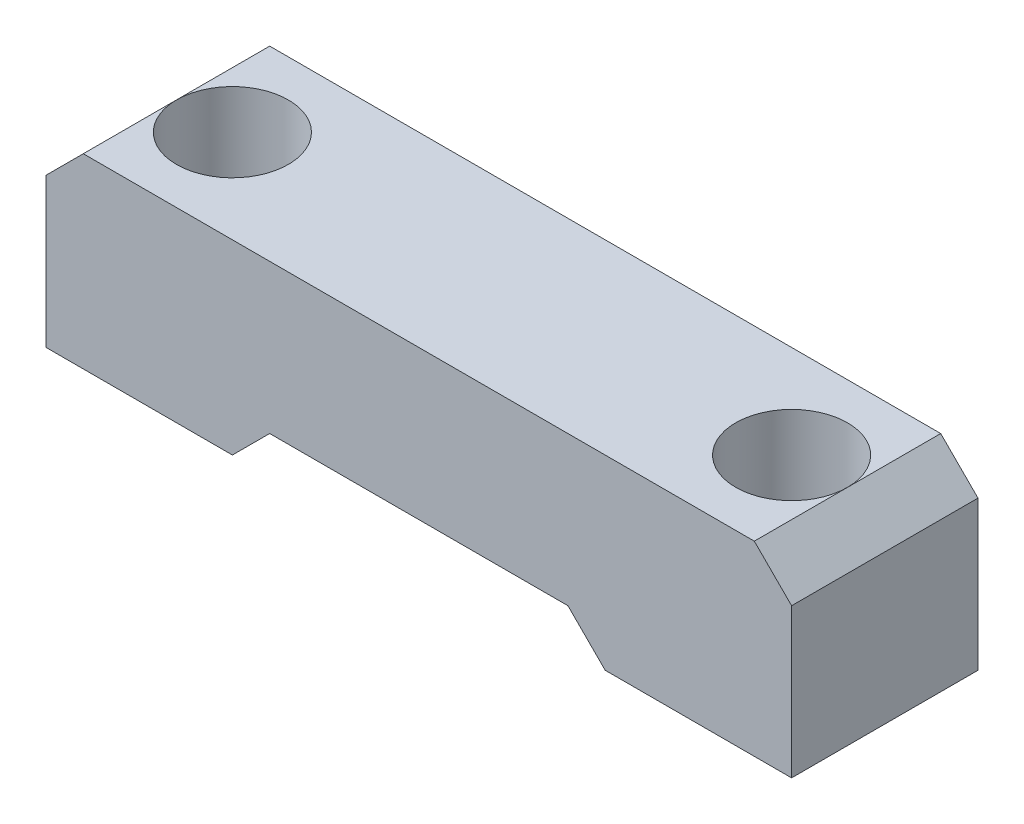
ISO-10303-21;
HEADER;
FILE_DESCRIPTION(('STEP AP214'),'2;1');
FILE_NAME('part.step','',(''),(''),'','','');
FILE_SCHEMA(('AUTOMOTIVE_DESIGN { 1 0 10303 214 1 1 1 1 }'));
ENDSEC;
DATA;
#1=APPLICATION_CONTEXT('core data for automotive mechanical design processes');
#2=APPLICATION_PROTOCOL_DEFINITION('international standard','automotive_design',2000,#1);
#3=PRODUCT_CONTEXT('',#1,'mechanical');
#4=PRODUCT('Part','Part','',(#3));
#5=PRODUCT_RELATED_PRODUCT_CATEGORY('part','',(#4));
#6=PRODUCT_DEFINITION_FORMATION('','',#4);
#7=PRODUCT_DEFINITION_CONTEXT('part definition',#1,'design');
#8=PRODUCT_DEFINITION('design','',#6,#7);
#9=PRODUCT_DEFINITION_SHAPE('','',#8);
#10=(LENGTH_UNIT() NAMED_UNIT(*) SI_UNIT(.MILLI.,.METRE.));
#11=(NAMED_UNIT(*) PLANE_ANGLE_UNIT() SI_UNIT($,.RADIAN.));
#12=(NAMED_UNIT(*) SI_UNIT($,.STERADIAN.) SOLID_ANGLE_UNIT());
#13=UNCERTAINTY_MEASURE_WITH_UNIT(LENGTH_MEASURE(1.E-05),#10,'distance_accuracy_value','');
#14=(GEOMETRIC_REPRESENTATION_CONTEXT(3) GLOBAL_UNCERTAINTY_ASSIGNED_CONTEXT((#13)) GLOBAL_UNIT_ASSIGNED_CONTEXT((#10,
#11,#12)) REPRESENTATION_CONTEXT('',''));
#15=CARTESIAN_POINT('',(0.,0.,0.));
#16=DIRECTION('',(0.,0.,1.));
#17=DIRECTION('',(1.,0.,0.));
#18=AXIS2_PLACEMENT_3D('',#15,#16,#17);
#19=CARTESIAN_POINT('',(5.,0.,2.5));
#20=DIRECTION('',(0.,1.,0.));
#21=DIRECTION('',(0.,0.,1.));
#22=AXIS2_PLACEMENT_3D('',#19,#20,#21);
#23=PLANE('',#22);
#24=CARTESIAN_POINT('',(7.5,0.,0.));
#25=DIRECTION('',(0.,1.,0.));
#26=DIRECTION('',(0.,0.,1.));
#27=AXIS2_PLACEMENT_3D('',#24,#25,#26);
#28=CIRCLE('',#27,1.5);
#29=CARTESIAN_POINT('',(7.5,0.,1.5));
#30=VERTEX_POINT('',#29);
#31=EDGE_CURVE('E207',#30,#30,#28,.T.);
#32=ORIENTED_EDGE('',*,*,#31,.T.);
#33=EDGE_LOOP('',(#32));
#34=FACE_BOUND('',#33,.T.);
#35=DIRECTION('',(1.,0.,0.));
#36=VECTOR('',#35,1.);
#37=CARTESIAN_POINT('',(5.,0.,-2.5));
#38=LINE('',#37,#36);
#39=CARTESIAN_POINT('',(5.,0.,-2.5));
#40=VERTEX_POINT('',#39);
#41=CARTESIAN_POINT('',(10.,0.,-2.5));
#42=VERTEX_POINT('',#41);
#43=EDGE_CURVE('E206',#40,#42,#38,.T.);
#44=ORIENTED_EDGE('',*,*,#43,.T.);
#45=DIRECTION('',(0.,0.,-1.));
#46=VECTOR('',#45,1.);
#47=CARTESIAN_POINT('',(10.,0.,2.5));
#48=LINE('',#47,#46);
#49=CARTESIAN_POINT('',(10.,0.,2.5));
#50=VERTEX_POINT('',#49);
#51=EDGE_CURVE('E136',#50,#42,#48,.T.);
#52=ORIENTED_EDGE('',*,*,#51,.F.);
#53=DIRECTION('',(1.,0.,0.));
#54=VECTOR('',#53,1.);
#55=CARTESIAN_POINT('',(5.,0.,2.5));
#56=LINE('',#55,#54);
#57=CARTESIAN_POINT('',(5.,0.,2.5));
#58=VERTEX_POINT('',#57);
#59=EDGE_CURVE('E123',#58,#50,#56,.T.);
#60=ORIENTED_EDGE('',*,*,#59,.F.);
#61=DIRECTION('',(0.,0.,-1.));
#62=VECTOR('',#61,1.);
#63=CARTESIAN_POINT('',(5.,0.,2.5));
#64=LINE('',#63,#62);
#65=EDGE_CURVE('E134',#58,#40,#64,.T.);
#66=ORIENTED_EDGE('',*,*,#65,.T.);
#67=EDGE_LOOP('',(#44,#52,#60,#66));
#68=FACE_BOUND('',#67,.T.);
#69=ADVANCED_FACE('F36',(#34,#68),#23,.F.);
#70=CARTESIAN_POINT('',(10.,0.,2.5));
#71=DIRECTION('',(-1.,0.,0.));
#72=DIRECTION('',(0.,-1.,0.));
#73=AXIS2_PLACEMENT_3D('',#70,#71,#72);
#74=PLANE('',#73);
#75=DIRECTION('',(0.,1.,0.));
#76=VECTOR('',#75,1.);
#77=CARTESIAN_POINT('',(10.,0.,-2.5));
#78=LINE('',#77,#76);
#79=CARTESIAN_POINT('',(10.,4.,-2.5));
#80=VERTEX_POINT('',#79);
#81=EDGE_CURVE('E204',#42,#80,#78,.T.);
#82=ORIENTED_EDGE('',*,*,#81,.T.);
#83=DIRECTION('',(0.,0.,1.));
#84=VECTOR('',#83,1.);
#85=CARTESIAN_POINT('',(10.,4.,2.5));
#86=LINE('',#85,#84);
#87=CARTESIAN_POINT('',(10.,4.,2.5));
#88=VERTEX_POINT('',#87);
#89=EDGE_CURVE('E59',#80,#88,#86,.T.);
#90=ORIENTED_EDGE('',*,*,#89,.T.);
#91=DIRECTION('',(0.,1.,0.));
#92=VECTOR('',#91,1.);
#93=CARTESIAN_POINT('',(10.,0.,2.5));
#94=LINE('',#93,#92);
#95=EDGE_CURVE('E137',#50,#88,#94,.T.);
#96=ORIENTED_EDGE('',*,*,#95,.F.);
#97=ORIENTED_EDGE('',*,*,#51,.T.);
#98=EDGE_LOOP('',(#82,#90,#96,#97));
#99=FACE_BOUND('',#98,.T.);
#100=ADVANCED_FACE('F258',(#99),#74,.F.);
#101=CARTESIAN_POINT('',(10.,5.,2.5));
#102=DIRECTION('',(0.,-1.,0.));
#103=DIRECTION('',(1.,0.,0.));
#104=AXIS2_PLACEMENT_3D('',#101,#102,#103);
#105=PLANE('',#104);
#106=DIRECTION('',(-1.,0.,0.));
#107=VECTOR('',#106,1.);
#108=CARTESIAN_POINT('',(10.,5.,2.5));
#109=LINE('',#108,#107);
#110=CARTESIAN_POINT('',(9.,5.,2.5));
#111=VERTEX_POINT('',#110);
#112=CARTESIAN_POINT('',(-9.,5.,2.5));
#113=VERTEX_POINT('',#112);
#114=EDGE_CURVE('E212',#111,#113,#109,.T.);
#115=ORIENTED_EDGE('',*,*,#114,.F.);
#116=DIRECTION('',(0.,0.,-1.));
#117=VECTOR('',#116,1.);
#118=CARTESIAN_POINT('',(9.,5.,2.5));
#119=LINE('',#118,#117);
#120=CARTESIAN_POINT('',(9.,5.,0.));
#121=VERTEX_POINT('',#120);
#122=EDGE_CURVE('E158',#111,#121,#119,.T.);
#123=ORIENTED_EDGE('',*,*,#122,.T.);
#124=CARTESIAN_POINT('',(7.5,5.,0.));
#125=DIRECTION('',(0.,1.,0.));
#126=DIRECTION('',(0.,0.,1.));
#127=AXIS2_PLACEMENT_3D('',#124,#125,#126);
#128=CIRCLE('',#127,1.5);
#129=EDGE_CURVE('E217',#121,#121,#128,.T.);
#130=ORIENTED_EDGE('',*,*,#129,.F.);
#131=DIRECTION('',(0.,0.,-1.));
#132=VECTOR('',#131,1.);
#133=CARTESIAN_POINT('',(9.,5.,2.5));
#134=LINE('',#133,#132);
#135=CARTESIAN_POINT('',(9.,5.,-2.5));
#136=VERTEX_POINT('',#135);
#137=EDGE_CURVE('E156',#121,#136,#134,.T.);
#138=ORIENTED_EDGE('',*,*,#137,.T.);
#139=DIRECTION('',(-1.,0.,0.));
#140=VECTOR('',#139,1.);
#141=CARTESIAN_POINT('',(10.,5.,-2.5));
#142=LINE('',#141,#140);
#143=CARTESIAN_POINT('',(-9.,5.,-2.5));
#144=VERTEX_POINT('',#143);
#145=EDGE_CURVE('E201',#136,#144,#142,.T.);
#146=ORIENTED_EDGE('',*,*,#145,.T.);
#147=DIRECTION('',(0.,0.,1.));
#148=VECTOR('',#147,1.);
#149=CARTESIAN_POINT('',(-9.,5.,2.5));
#150=LINE('',#149,#148);
#151=CARTESIAN_POINT('',(-9.,5.,0.));
#152=VERTEX_POINT('',#151);
#153=EDGE_CURVE('E154',#144,#152,#150,.T.);
#154=ORIENTED_EDGE('',*,*,#153,.T.);
#155=CARTESIAN_POINT('',(-7.5,5.,0.));
#156=DIRECTION('',(0.,1.,0.));
#157=DIRECTION('',(0.,0.,1.));
#158=AXIS2_PLACEMENT_3D('',#155,#156,#157);
#159=CIRCLE('',#158,1.5);
#160=EDGE_CURVE('E223',#152,#152,#159,.T.);
#161=ORIENTED_EDGE('',*,*,#160,.F.);
#162=DIRECTION('',(0.,0.,1.));
#163=VECTOR('',#162,1.);
#164=CARTESIAN_POINT('',(-9.,5.,2.5));
#165=LINE('',#164,#163);
#166=EDGE_CURVE('E152',#152,#113,#165,.T.);
#167=ORIENTED_EDGE('',*,*,#166,.T.);
#168=EDGE_LOOP('',(#115,#123,#130,#138,#146,#154,#161,#167));
#169=FACE_BOUND('',#168,.T.);
#170=ADVANCED_FACE('F231',(#169),#105,.F.);
#171=CARTESIAN_POINT('',(-10.,0.,2.5));
#172=DIRECTION('',(1.,0.,0.));
#173=DIRECTION('',(0.,1.,0.));
#174=AXIS2_PLACEMENT_3D('',#171,#172,#173);
#175=PLANE('',#174);
#176=DIRECTION('',(0.,-1.,0.));
#177=VECTOR('',#176,1.);
#178=CARTESIAN_POINT('',(-10.,0.,2.5));
#179=LINE('',#178,#177);
#180=CARTESIAN_POINT('',(-10.,3.99999999999999,2.5));
#181=VERTEX_POINT('',#180);
#182=CARTESIAN_POINT('',(-10.,0.,2.5));
#183=VERTEX_POINT('',#182);
#184=EDGE_CURVE('E210',#181,#183,#179,.T.);
#185=ORIENTED_EDGE('',*,*,#184,.F.);
#186=DIRECTION('',(0.,0.,-1.));
#187=VECTOR('',#186,1.);
#188=CARTESIAN_POINT('',(-10.,3.99999999999999,2.5));
#189=LINE('',#188,#187);
#190=CARTESIAN_POINT('',(-10.,3.99999999999999,-2.5));
#191=VERTEX_POINT('',#190);
#192=EDGE_CURVE('E169',#181,#191,#189,.T.);
#193=ORIENTED_EDGE('',*,*,#192,.T.);
#194=DIRECTION('',(0.,-1.,0.));
#195=VECTOR('',#194,1.);
#196=CARTESIAN_POINT('',(-10.,0.,-2.5));
#197=LINE('',#196,#195);
#198=CARTESIAN_POINT('',(-10.,0.,-2.5));
#199=VERTEX_POINT('',#198);
#200=EDGE_CURVE('E192',#191,#199,#197,.T.);
#201=ORIENTED_EDGE('',*,*,#200,.T.);
#202=DIRECTION('',(0.,0.,-1.));
#203=VECTOR('',#202,1.);
#204=CARTESIAN_POINT('',(-10.,0.,2.5));
#205=LINE('',#204,#203);
#206=EDGE_CURVE('E147',#183,#199,#205,.T.);
#207=ORIENTED_EDGE('',*,*,#206,.F.);
#208=EDGE_LOOP('',(#185,#193,#201,#207));
#209=FACE_BOUND('',#208,.T.);
#210=ADVANCED_FACE('F236',(#209),#175,.F.);
#211=CARTESIAN_POINT('',(-5.,0.,2.5));
#212=DIRECTION('',(0.,1.,0.));
#213=DIRECTION('',(-1.,0.,0.));
#214=AXIS2_PLACEMENT_3D('',#211,#212,#213);
#215=PLANE('',#214);
#216=CARTESIAN_POINT('',(-7.5,0.,0.));
#217=DIRECTION('',(0.,1.,0.));
#218=DIRECTION('',(0.,0.,1.));
#219=AXIS2_PLACEMENT_3D('',#216,#217,#218);
#220=CIRCLE('',#219,1.5);
#221=CARTESIAN_POINT('',(-7.5,0.,1.5));
#222=VERTEX_POINT('',#221);
#223=EDGE_CURVE('E220',#222,#222,#220,.T.);
#224=ORIENTED_EDGE('',*,*,#223,.T.);
#225=EDGE_LOOP('',(#224));
#226=FACE_BOUND('',#225,.T.);
#227=DIRECTION('',(1.,0.,0.));
#228=VECTOR('',#227,1.);
#229=CARTESIAN_POINT('',(-5.,0.,-2.5));
#230=LINE('',#229,#228);
#231=CARTESIAN_POINT('',(-5.,0.,-2.5));
#232=VERTEX_POINT('',#231);
#233=EDGE_CURVE('E179',#199,#232,#230,.T.);
#234=ORIENTED_EDGE('',*,*,#233,.T.);
#235=DIRECTION('',(0.,0.,-1.));
#236=VECTOR('',#235,1.);
#237=CARTESIAN_POINT('',(-5.,0.,2.5));
#238=LINE('',#237,#236);
#239=CARTESIAN_POINT('',(-5.,0.,2.5));
#240=VERTEX_POINT('',#239);
#241=EDGE_CURVE('E189',#240,#232,#238,.T.);
#242=ORIENTED_EDGE('',*,*,#241,.F.);
#243=DIRECTION('',(1.,0.,0.));
#244=VECTOR('',#243,1.);
#245=CARTESIAN_POINT('',(-5.,0.,2.5));
#246=LINE('',#245,#244);
#247=EDGE_CURVE('E196',#183,#240,#246,.T.);
#248=ORIENTED_EDGE('',*,*,#247,.F.);
#249=ORIENTED_EDGE('',*,*,#206,.T.);
#250=EDGE_LOOP('',(#234,#242,#248,#249));
#251=FACE_BOUND('',#250,.T.);
#252=ADVANCED_FACE('F187',(#226,#251),#215,.F.);
#253=CARTESIAN_POINT('',(5.,1.,2.5));
#254=DIRECTION('',(0.,1.,0.));
#255=DIRECTION('',(-1.,0.,0.));
#256=AXIS2_PLACEMENT_3D('',#253,#254,#255);
#257=PLANE('',#256);
#258=DIRECTION('',(1.,0.,0.));
#259=VECTOR('',#258,1.);
#260=CARTESIAN_POINT('',(5.,1.,-2.5));
#261=LINE('',#260,#259);
#262=CARTESIAN_POINT('',(-3.99999999999999,0.999999999999999,-2.5));
#263=VERTEX_POINT('',#262);
#264=CARTESIAN_POINT('',(4.,1.,-2.5));
#265=VERTEX_POINT('',#264);
#266=EDGE_CURVE('E138',#263,#265,#261,.T.);
#267=ORIENTED_EDGE('',*,*,#266,.T.);
#268=DIRECTION('',(0.,0.,1.));
#269=VECTOR('',#268,1.);
#270=CARTESIAN_POINT('',(4.,1.,2.5));
#271=LINE('',#270,#269);
#272=CARTESIAN_POINT('',(4.,1.,2.5));
#273=VERTEX_POINT('',#272);
#274=EDGE_CURVE('E145',#265,#273,#271,.T.);
#275=ORIENTED_EDGE('',*,*,#274,.T.);
#276=DIRECTION('',(1.,0.,0.));
#277=VECTOR('',#276,1.);
#278=CARTESIAN_POINT('',(5.,1.,2.5));
#279=LINE('',#278,#277);
#280=CARTESIAN_POINT('',(-3.99999999999999,0.999999999999999,2.5));
#281=VERTEX_POINT('',#280);
#282=EDGE_CURVE('E126',#281,#273,#279,.T.);
#283=ORIENTED_EDGE('',*,*,#282,.F.);
#284=DIRECTION('',(0.,0.,-1.));
#285=VECTOR('',#284,1.);
#286=CARTESIAN_POINT('',(-3.99999999999999,0.999999999999999,-2.5));
#287=LINE('',#286,#285);
#288=EDGE_CURVE('E142',#281,#263,#287,.T.);
#289=ORIENTED_EDGE('',*,*,#288,.T.);
#290=EDGE_LOOP('',(#267,#275,#283,#289));
#291=FACE_BOUND('',#290,.T.);
#292=ADVANCED_FACE('F317',(#291),#257,.F.);
#293=CARTESIAN_POINT('',(0.,0.,2.5));
#294=DIRECTION('',(0.,0.,1.));
#295=DIRECTION('',(1.,0.,0.));
#296=AXIS2_PLACEMENT_3D('',#293,#294,#295);
#297=PLANE('',#296);
#298=ORIENTED_EDGE('',*,*,#95,.T.);
#299=DIRECTION('',(0.707106781186546,-0.707106781186549,0.));
#300=VECTOR('',#299,1.);
#301=CARTESIAN_POINT('',(7.00000000000002,6.99999999999999,2.5));
#302=LINE('',#301,#300);
#303=EDGE_CURVE('E167',#88,#111,#302,.F.);
#304=ORIENTED_EDGE('',*,*,#303,.T.);
#305=ORIENTED_EDGE('',*,*,#114,.T.);
#306=DIRECTION('',(0.707106781186548,0.707106781186547,0.));
#307=VECTOR('',#306,1.);
#308=CARTESIAN_POINT('',(-6.99999999999999,7.,2.5));
#309=LINE('',#308,#307);
#310=EDGE_CURVE('E51',#113,#181,#309,.F.);
#311=ORIENTED_EDGE('',*,*,#310,.T.);
#312=ORIENTED_EDGE('',*,*,#184,.T.);
#313=ORIENTED_EDGE('',*,*,#247,.T.);
#314=DIRECTION('',(-0.70710678118655,-0.707106781186545,0.));
#315=VECTOR('',#314,1.);
#316=CARTESIAN_POINT('',(-3.99999999999999,0.999999999999999,2.5));
#317=LINE('',#316,#315);
#318=EDGE_CURVE('E11',#240,#281,#317,.F.);
#319=ORIENTED_EDGE('',*,*,#318,.T.);
#320=ORIENTED_EDGE('',*,*,#282,.T.);
#321=DIRECTION('',(-0.707106781186544,0.707106781186551,0.));
#322=VECTOR('',#321,1.);
#323=CARTESIAN_POINT('',(5.,0.,2.5));
#324=LINE('',#323,#322);
#325=EDGE_CURVE('E120',#273,#58,#324,.F.);
#326=ORIENTED_EDGE('',*,*,#325,.T.);
#327=ORIENTED_EDGE('',*,*,#59,.T.);
#328=EDGE_LOOP('',(#298,#304,#305,#311,#312,#313,#319,#320,#326,#327));
#329=FACE_BOUND('',#328,.T.);
#330=ADVANCED_FACE('F122',(#329),#297,.T.);
#331=CARTESIAN_POINT('',(0.,0.,-2.5));
#332=DIRECTION('',(0.,0.,1.));
#333=DIRECTION('',(1.,0.,0.));
#334=AXIS2_PLACEMENT_3D('',#331,#332,#333);
#335=PLANE('',#334);
#336=ORIENTED_EDGE('',*,*,#145,.F.);
#337=DIRECTION('',(-0.707106781186546,0.707106781186549,0.));
#338=VECTOR('',#337,1.);
#339=CARTESIAN_POINT('',(9.,5.,-2.5));
#340=LINE('',#339,#338);
#341=EDGE_CURVE('E163',#136,#80,#340,.F.);
#342=ORIENTED_EDGE('',*,*,#341,.T.);
#343=ORIENTED_EDGE('',*,*,#81,.F.);
#344=ORIENTED_EDGE('',*,*,#43,.F.);
#345=DIRECTION('',(0.707106781186544,-0.707106781186551,0.));
#346=VECTOR('',#345,1.);
#347=CARTESIAN_POINT('',(2.50000000000002,2.5,-2.5));
#348=LINE('',#347,#346);
#349=EDGE_CURVE('E130',#40,#265,#348,.F.);
#350=ORIENTED_EDGE('',*,*,#349,.T.);
#351=ORIENTED_EDGE('',*,*,#266,.F.);
#352=DIRECTION('',(0.70710678118655,0.707106781186545,0.));
#353=VECTOR('',#352,1.);
#354=CARTESIAN_POINT('',(-2.49999999999998,2.5,-2.5));
#355=LINE('',#354,#353);
#356=EDGE_CURVE('E44',#263,#232,#355,.F.);
#357=ORIENTED_EDGE('',*,*,#356,.T.);
#358=ORIENTED_EDGE('',*,*,#233,.F.);
#359=ORIENTED_EDGE('',*,*,#200,.F.);
#360=DIRECTION('',(-0.707106781186548,-0.707106781186547,0.));
#361=VECTOR('',#360,1.);
#362=CARTESIAN_POINT('',(-10.,3.99999999999999,-2.5));
#363=LINE('',#362,#361);
#364=EDGE_CURVE('E161',#191,#144,#363,.F.);
#365=ORIENTED_EDGE('',*,*,#364,.T.);
#366=EDGE_LOOP('',(#336,#342,#343,#344,#350,#351,#357,#358,#359,#365));
#367=FACE_BOUND('',#366,.T.);
#368=ADVANCED_FACE('F177',(#367),#335,.F.);
#369=CARTESIAN_POINT('',(7.5,5.,0.));
#370=DIRECTION('',(0.,1.,0.));
#371=DIRECTION('',(0.,0.,1.));
#372=AXIS2_PLACEMENT_3D('',#369,#370,#371);
#373=CYLINDRICAL_SURFACE('',#372,1.5);
#374=ORIENTED_EDGE('',*,*,#31,.F.);
#375=EDGE_LOOP('',(#374));
#376=FACE_BOUND('',#375,.T.);
#377=ORIENTED_EDGE('',*,*,#129,.T.);
#378=EDGE_LOOP('',(#377));
#379=FACE_BOUND('',#378,.T.);
#380=ADVANCED_FACE('F244',(#376,#379),#373,.F.);
#381=CARTESIAN_POINT('',(-7.5,5.,0.));
#382=DIRECTION('',(0.,1.,0.));
#383=DIRECTION('',(0.,0.,1.));
#384=AXIS2_PLACEMENT_3D('',#381,#382,#383);
#385=CYLINDRICAL_SURFACE('',#384,1.5);
#386=ORIENTED_EDGE('',*,*,#223,.F.);
#387=EDGE_LOOP('',(#386));
#388=FACE_BOUND('',#387,.T.);
#389=ORIENTED_EDGE('',*,*,#160,.T.);
#390=EDGE_LOOP('',(#389));
#391=FACE_BOUND('',#390,.T.);
#392=ADVANCED_FACE('F227',(#388,#391),#385,.F.);
#393=CARTESIAN_POINT('',(5.,0.,2.5));
#394=DIRECTION('',(-0.707106781186551,-0.707106781186544,0.));
#395=DIRECTION('',(0.,0.,1.));
#396=AXIS2_PLACEMENT_3D('',#393,#394,#395);
#397=PLANE('',#396);
#398=ORIENTED_EDGE('',*,*,#325,.F.);
#399=ORIENTED_EDGE('',*,*,#274,.F.);
#400=ORIENTED_EDGE('',*,*,#349,.F.);
#401=ORIENTED_EDGE('',*,*,#65,.F.);
#402=EDGE_LOOP('',(#398,#399,#400,#401));
#403=FACE_BOUND('',#402,.T.);
#404=ADVANCED_FACE('F140',(#403),#397,.T.);
#405=CARTESIAN_POINT('',(-3.99999999999999,0.999999999999999,2.5));
#406=DIRECTION('',(0.707106781186545,-0.70710678118655,0.));
#407=DIRECTION('',(0.,0.,1.));
#408=AXIS2_PLACEMENT_3D('',#405,#406,#407);
#409=PLANE('',#408);
#410=ORIENTED_EDGE('',*,*,#318,.F.);
#411=ORIENTED_EDGE('',*,*,#241,.T.);
#412=ORIENTED_EDGE('',*,*,#356,.F.);
#413=ORIENTED_EDGE('',*,*,#288,.F.);
#414=EDGE_LOOP('',(#410,#411,#412,#413));
#415=FACE_BOUND('',#414,.T.);
#416=ADVANCED_FACE('F194',(#415),#409,.T.);
#417=CARTESIAN_POINT('',(9.,5.,2.5));
#418=DIRECTION('',(-0.707106781186549,-0.707106781186546,0.));
#419=DIRECTION('',(0.,0.,-1.));
#420=AXIS2_PLACEMENT_3D('',#417,#418,#419);
#421=PLANE('',#420);
#422=ORIENTED_EDGE('',*,*,#303,.F.);
#423=ORIENTED_EDGE('',*,*,#89,.F.);
#424=ORIENTED_EDGE('',*,*,#341,.F.);
#425=ORIENTED_EDGE('',*,*,#137,.F.);
#426=ORIENTED_EDGE('',*,*,#122,.F.);
#427=EDGE_LOOP('',(#422,#423,#424,#425,#426));
#428=FACE_BOUND('',#427,.T.);
#429=ADVANCED_FACE('F242',(#428),#421,.F.);
#430=CARTESIAN_POINT('',(-10.,3.99999999999999,2.5));
#431=DIRECTION('',(0.707106781186547,-0.707106781186548,0.));
#432=DIRECTION('',(0.,0.,-1.));
#433=AXIS2_PLACEMENT_3D('',#430,#431,#432);
#434=PLANE('',#433);
#435=ORIENTED_EDGE('',*,*,#166,.F.);
#436=ORIENTED_EDGE('',*,*,#153,.F.);
#437=ORIENTED_EDGE('',*,*,#364,.F.);
#438=ORIENTED_EDGE('',*,*,#192,.F.);
#439=ORIENTED_EDGE('',*,*,#310,.F.);
#440=EDGE_LOOP('',(#435,#436,#437,#438,#439));
#441=FACE_BOUND('',#440,.T.);
#442=ADVANCED_FACE('F38',(#441),#434,.F.);
#443=CLOSED_SHELL('',(#69,#100,#170,#210,#252,#292,#330,#368,#380,#392,#404,#416,#429,#442));
#444=MANIFOLD_SOLID_BREP('B2',#443);
#445=ADVANCED_BREP_SHAPE_REPRESENTATION('',(#18,#444),#14);
#446=SHAPE_DEFINITION_REPRESENTATION(#9,#445);
ENDSEC;
END-ISO-10303-21;
